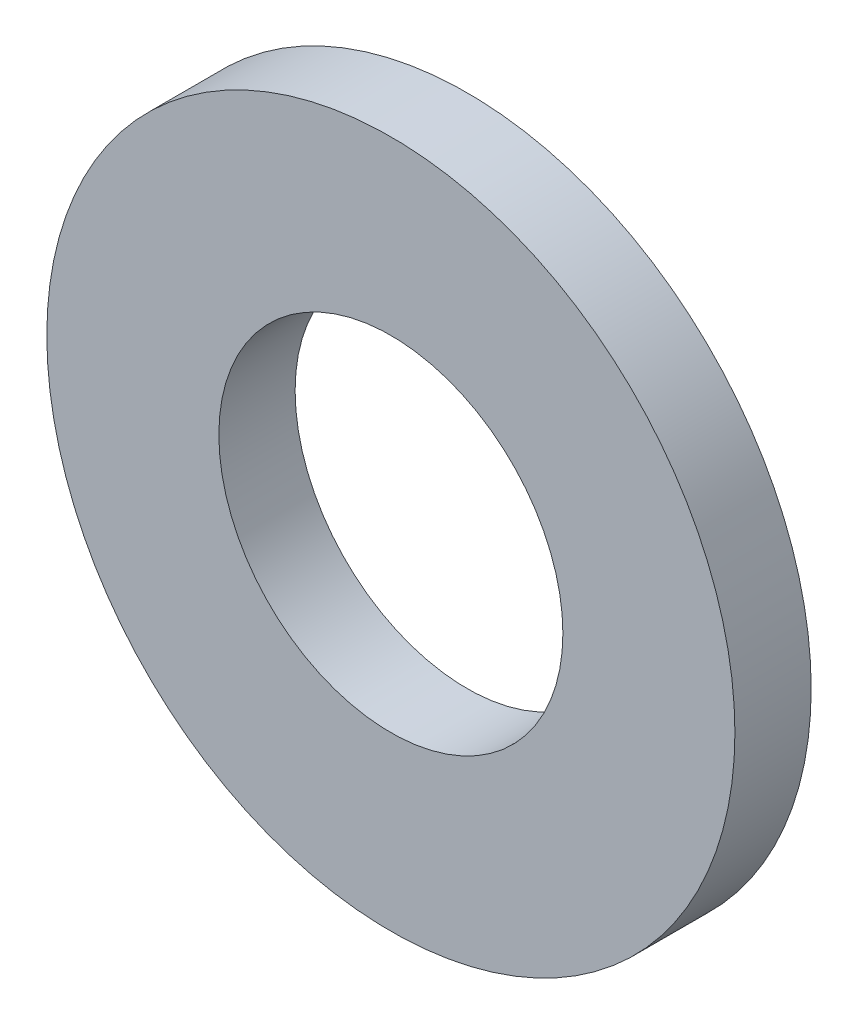
ISO-10303-21;
HEADER;
FILE_DESCRIPTION(('STEP AP214'),'2;1');
FILE_NAME('part.step','',(''),(''),'','','');
FILE_SCHEMA(('AUTOMOTIVE_DESIGN { 1 0 10303 214 1 1 1 1 }'));
ENDSEC;
DATA;
#1=APPLICATION_CONTEXT('core data for automotive mechanical design processes');
#2=APPLICATION_PROTOCOL_DEFINITION('international standard','automotive_design',2000,#1);
#3=PRODUCT_CONTEXT('',#1,'mechanical');
#4=PRODUCT('Part','Part','',(#3));
#5=PRODUCT_RELATED_PRODUCT_CATEGORY('part','',(#4));
#6=PRODUCT_DEFINITION_FORMATION('','',#4);
#7=PRODUCT_DEFINITION_CONTEXT('part definition',#1,'design');
#8=PRODUCT_DEFINITION('design','',#6,#7);
#9=PRODUCT_DEFINITION_SHAPE('','',#8);
#10=(LENGTH_UNIT() NAMED_UNIT(*) SI_UNIT(.MILLI.,.METRE.));
#11=(NAMED_UNIT(*) PLANE_ANGLE_UNIT() SI_UNIT($,.RADIAN.));
#12=(NAMED_UNIT(*) SI_UNIT($,.STERADIAN.) SOLID_ANGLE_UNIT());
#13=UNCERTAINTY_MEASURE_WITH_UNIT(LENGTH_MEASURE(1.E-05),#10,'distance_accuracy_value','');
#14=(GEOMETRIC_REPRESENTATION_CONTEXT(3) GLOBAL_UNCERTAINTY_ASSIGNED_CONTEXT((#13)) GLOBAL_UNIT_ASSIGNED_CONTEXT((#10,
#11,#12)) REPRESENTATION_CONTEXT('',''));
#15=CARTESIAN_POINT('',(0.,0.,0.));
#16=DIRECTION('',(0.,0.,1.));
#17=DIRECTION('',(1.,0.,0.));
#18=AXIS2_PLACEMENT_3D('',#15,#16,#17);
#19=CARTESIAN_POINT('',(0.,2.5781,0.));
#20=DIRECTION('',(0.,0.,-1.));
#21=DIRECTION('',(-1.,0.,0.));
#22=AXIS2_PLACEMENT_3D('',#19,#20,#21);
#23=PLANE('',#22);
#24=CARTESIAN_POINT('',(0.,0.,0.));
#25=DIRECTION('',(0.,0.,1.));
#26=DIRECTION('',(1.,0.,0.));
#27=AXIS2_PLACEMENT_3D('',#24,#25,#26);
#28=CIRCLE('',#27,2.5781);
#29=CARTESIAN_POINT('',(2.5781,0.,0.));
#30=VERTEX_POINT('',#29);
#31=EDGE_CURVE('E47',#30,#30,#28,.T.);
#32=ORIENTED_EDGE('',*,*,#31,.F.);
#33=EDGE_LOOP('',(#32));
#34=FACE_BOUND('',#33,.T.);
#35=CARTESIAN_POINT('',(0.,0.,0.));
#36=DIRECTION('',(0.,0.,1.));
#37=DIRECTION('',(1.,0.,0.));
#38=AXIS2_PLACEMENT_3D('',#35,#36,#37);
#39=CIRCLE('',#38,5.1562);
#40=CARTESIAN_POINT('',(5.1562,0.,0.));
#41=VERTEX_POINT('',#40);
#42=EDGE_CURVE('E10',#41,#41,#39,.T.);
#43=ORIENTED_EDGE('',*,*,#42,.T.);
#44=EDGE_LOOP('',(#43));
#45=FACE_BOUND('',#44,.T.);
#46=ADVANCED_FACE('F33',(#34,#45),#23,.F.);
#47=CARTESIAN_POINT('',(0.,0.,0.));
#48=DIRECTION('',(0.,0.,1.));
#49=DIRECTION('',(1.,0.,0.));
#50=AXIS2_PLACEMENT_3D('',#47,#48,#49);
#51=CYLINDRICAL_SURFACE('',#50,5.1562);
#52=ORIENTED_EDGE('',*,*,#42,.F.);
#53=EDGE_LOOP('',(#52));
#54=FACE_BOUND('',#53,.T.);
#55=CARTESIAN_POINT('',(0.,0.,-1.143));
#56=DIRECTION('',(0.,0.,1.));
#57=DIRECTION('',(1.,0.,0.));
#58=AXIS2_PLACEMENT_3D('',#55,#56,#57);
#59=CIRCLE('',#58,5.1562);
#60=CARTESIAN_POINT('',(5.1562,0.,-1.143));
#61=VERTEX_POINT('',#60);
#62=EDGE_CURVE('E39',#61,#61,#59,.T.);
#63=ORIENTED_EDGE('',*,*,#62,.T.);
#64=EDGE_LOOP('',(#63));
#65=FACE_BOUND('',#64,.T.);
#66=ADVANCED_FACE('F56',(#54,#65),#51,.T.);
#67=CARTESIAN_POINT('',(0.,2.5781,-1.143));
#68=DIRECTION('',(0.,0.,1.));
#69=DIRECTION('',(1.,0.,0.));
#70=AXIS2_PLACEMENT_3D('',#67,#68,#69);
#71=PLANE('',#70);
#72=ORIENTED_EDGE('',*,*,#62,.F.);
#73=EDGE_LOOP('',(#72));
#74=FACE_BOUND('',#73,.T.);
#75=CARTESIAN_POINT('',(0.,0.,-1.143));
#76=DIRECTION('',(0.,0.,1.));
#77=DIRECTION('',(1.,0.,0.));
#78=AXIS2_PLACEMENT_3D('',#75,#76,#77);
#79=CIRCLE('',#78,2.5781);
#80=CARTESIAN_POINT('',(2.5781,0.,-1.143));
#81=VERTEX_POINT('',#80);
#82=EDGE_CURVE('E43',#81,#81,#79,.T.);
#83=ORIENTED_EDGE('',*,*,#82,.T.);
#84=EDGE_LOOP('',(#83));
#85=FACE_BOUND('',#84,.T.);
#86=ADVANCED_FACE('F60',(#74,#85),#71,.F.);
#87=CARTESIAN_POINT('',(0.,0.,0.));
#88=DIRECTION('',(0.,0.,1.));
#89=DIRECTION('',(1.,0.,0.));
#90=AXIS2_PLACEMENT_3D('',#87,#88,#89);
#91=CYLINDRICAL_SURFACE('',#90,2.5781);
#92=ORIENTED_EDGE('',*,*,#82,.F.);
#93=EDGE_LOOP('',(#92));
#94=FACE_BOUND('',#93,.T.);
#95=ORIENTED_EDGE('',*,*,#31,.T.);
#96=EDGE_LOOP('',(#95));
#97=FACE_BOUND('',#96,.T.);
#98=ADVANCED_FACE('F53',(#94,#97),#91,.F.);
#99=CLOSED_SHELL('',(#46,#66,#86,#98));
#100=MANIFOLD_SOLID_BREP('B2',#99);
#101=ADVANCED_BREP_SHAPE_REPRESENTATION('',(#18,#100),#14);
#102=SHAPE_DEFINITION_REPRESENTATION(#9,#101);
ENDSEC;
END-ISO-10303-21;
